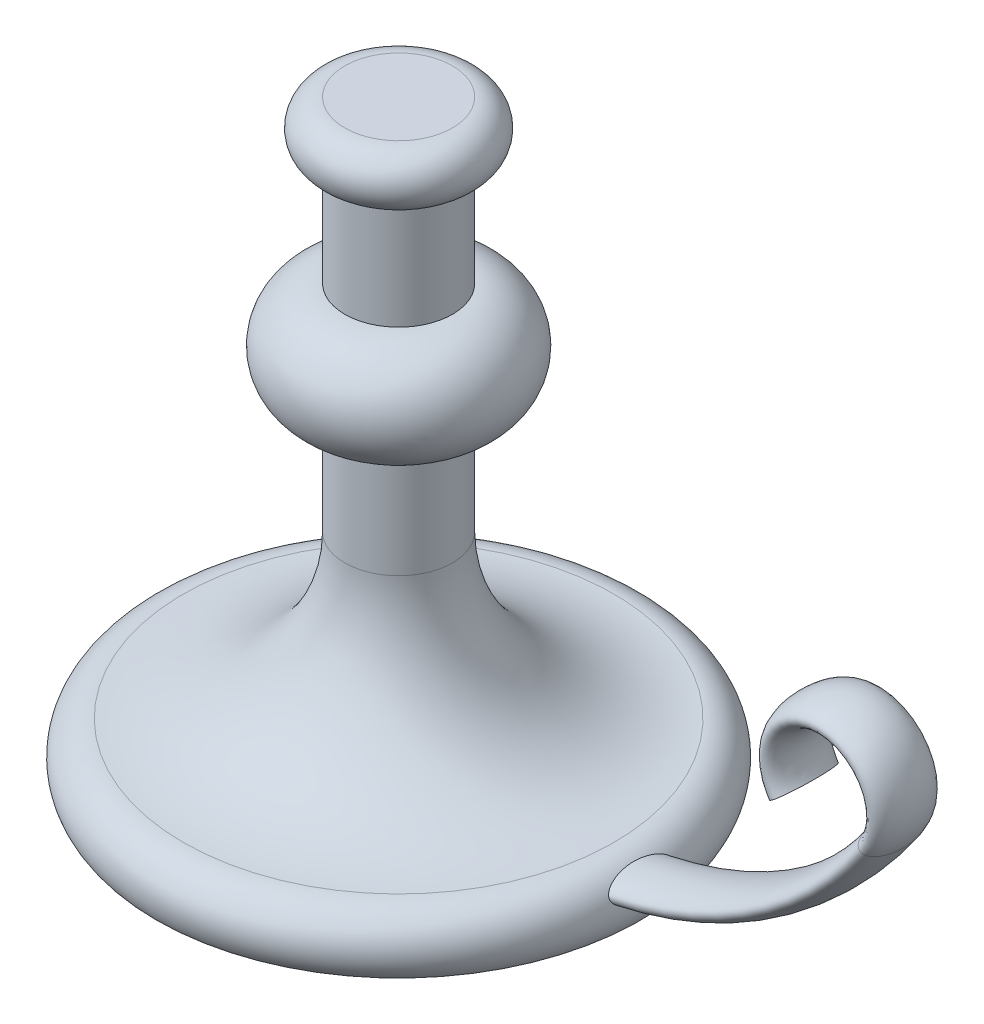
ISO-10303-21;
HEADER;
FILE_DESCRIPTION(('STEP AP214'),'2;1');
FILE_NAME('part.step','',(''),(''),'','','');
FILE_SCHEMA(('AUTOMOTIVE_DESIGN { 1 0 10303 214 1 1 1 1 }'));
ENDSEC;
DATA;
#1=APPLICATION_CONTEXT('core data for automotive mechanical design processes');
#2=APPLICATION_PROTOCOL_DEFINITION('international standard','automotive_design',2000,#1);
#3=PRODUCT_CONTEXT('',#1,'mechanical');
#4=PRODUCT('Part','Part','',(#3));
#5=PRODUCT_RELATED_PRODUCT_CATEGORY('part','',(#4));
#6=PRODUCT_DEFINITION_FORMATION('','',#4);
#7=PRODUCT_DEFINITION_CONTEXT('part definition',#1,'design');
#8=PRODUCT_DEFINITION('design','',#6,#7);
#9=PRODUCT_DEFINITION_SHAPE('','',#8);
#10=(LENGTH_UNIT() NAMED_UNIT(*) SI_UNIT(.MILLI.,.METRE.));
#11=(NAMED_UNIT(*) PLANE_ANGLE_UNIT() SI_UNIT($,.RADIAN.));
#12=(NAMED_UNIT(*) SI_UNIT($,.STERADIAN.) SOLID_ANGLE_UNIT());
#13=UNCERTAINTY_MEASURE_WITH_UNIT(LENGTH_MEASURE(1.E-05),#10,'distance_accuracy_value','');
#14=(GEOMETRIC_REPRESENTATION_CONTEXT(3) GLOBAL_UNCERTAINTY_ASSIGNED_CONTEXT((#13)) GLOBAL_UNIT_ASSIGNED_CONTEXT((#10,
#11,#12)) REPRESENTATION_CONTEXT('',''));
#15=CARTESIAN_POINT('',(0.,0.,0.));
#16=DIRECTION('',(0.,0.,1.));
#17=DIRECTION('',(1.,0.,0.));
#18=AXIS2_PLACEMENT_3D('',#15,#16,#17);
#19=CARTESIAN_POINT('',(0.,0.,0.));
#20=DIRECTION('',(0.,1.,0.));
#21=DIRECTION('',(0.,0.,1.));
#22=AXIS2_PLACEMENT_3D('',#19,#20,#21);
#23=PLANE('',#22);
#24=CARTESIAN_POINT('',(0.,0.,0.));
#25=DIRECTION('',(0.,1.,0.));
#26=DIRECTION('',(0.,0.,1.));
#27=AXIS2_PLACEMENT_3D('',#24,#25,#26);
#28=CIRCLE('',#27,90.);
#29=CARTESIAN_POINT('',(0.,0.,90.));
#30=VERTEX_POINT('',#29);
#31=EDGE_CURVE('E66',#30,#30,#28,.T.);
#32=ORIENTED_EDGE('',*,*,#31,.F.);
#33=EDGE_LOOP('',(#32));
#34=FACE_BOUND('',#33,.T.);
#35=ADVANCED_FACE('F36',(#34),#23,.F.);
#36=CARTESIAN_POINT('',(0.,220.,0.));
#37=DIRECTION('',(0.,-1.,0.));
#38=DIRECTION('',(0.,0.,-1.));
#39=AXIS2_PLACEMENT_3D('',#36,#37,#38);
#40=PLANE('',#39);
#41=CARTESIAN_POINT('',(0.,220.,0.));
#42=DIRECTION('',(0.,1.,0.));
#43=DIRECTION('',(0.,0.,1.));
#44=AXIS2_PLACEMENT_3D('',#41,#42,#43);
#45=CIRCLE('',#44,20.);
#46=CARTESIAN_POINT('',(0.,220.,20.));
#47=VERTEX_POINT('',#46);
#48=EDGE_CURVE('E10',#47,#47,#45,.T.);
#49=ORIENTED_EDGE('',*,*,#48,.T.);
#50=EDGE_LOOP('',(#49));
#51=FACE_BOUND('',#50,.T.);
#52=ADVANCED_FACE('F108',(#51),#40,.F.);
#53=CARTESIAN_POINT('',(0.,210.,0.));
#54=DIRECTION('',(0.,1.,0.));
#55=DIRECTION('',(0.,0.,1.));
#56=AXIS2_PLACEMENT_3D('',#53,#54,#55);
#57=TOROIDAL_SURFACE('',#56,20.,10.);
#58=ORIENTED_EDGE('',*,*,#48,.F.);
#59=EDGE_LOOP('',(#58));
#60=FACE_BOUND('',#59,.T.);
#61=CARTESIAN_POINT('',(0.,200.,0.));
#62=DIRECTION('',(0.,1.,0.));
#63=DIRECTION('',(0.,0.,1.));
#64=AXIS2_PLACEMENT_3D('',#61,#62,#63);
#65=CIRCLE('',#64,20.);
#66=CARTESIAN_POINT('',(0.,200.,20.));
#67=VERTEX_POINT('',#66);
#68=EDGE_CURVE('E48',#67,#67,#65,.T.);
#69=ORIENTED_EDGE('',*,*,#68,.T.);
#70=EDGE_LOOP('',(#69));
#71=FACE_BOUND('',#70,.T.);
#72=ADVANCED_FACE('F105',(#60,#71),#57,.T.);
#73=CARTESIAN_POINT('',(0.,301.66189863104,0.));
#74=DIRECTION('',(0.,1.,0.));
#75=DIRECTION('',(0.,0.,1.));
#76=AXIS2_PLACEMENT_3D('',#73,#74,#75);
#77=CYLINDRICAL_SURFACE('',#76,20.);
#78=ORIENTED_EDGE('',*,*,#68,.F.);
#79=EDGE_LOOP('',(#78));
#80=FACE_BOUND('',#79,.T.);
#81=CARTESIAN_POINT('',(0.,160.,0.));
#82=DIRECTION('',(0.,1.,0.));
#83=DIRECTION('',(0.,0.,1.));
#84=AXIS2_PLACEMENT_3D('',#81,#82,#83);
#85=CIRCLE('',#84,20.);
#86=CARTESIAN_POINT('',(0.,160.,20.));
#87=VERTEX_POINT('',#86);
#88=EDGE_CURVE('E52',#87,#87,#85,.T.);
#89=ORIENTED_EDGE('',*,*,#88,.T.);
#90=EDGE_LOOP('',(#89));
#91=FACE_BOUND('',#90,.T.);
#92=ADVANCED_FACE('F101',(#80,#91),#77,.T.);
#93=CARTESIAN_POINT('',(0.,140.,0.));
#94=DIRECTION('',(0.,1.,0.));
#95=DIRECTION('',(0.,0.,1.));
#96=AXIS2_PLACEMENT_3D('',#93,#94,#95);
#97=DEGENERATE_TOROIDAL_SURFACE('',#96,19.9999999999999,20.,.T.);
#98=ORIENTED_EDGE('',*,*,#88,.F.);
#99=EDGE_LOOP('',(#98));
#100=FACE_BOUND('',#99,.T.);
#101=CARTESIAN_POINT('',(0.,120.,0.));
#102=DIRECTION('',(0.,1.,0.));
#103=DIRECTION('',(0.,0.,1.));
#104=AXIS2_PLACEMENT_3D('',#101,#102,#103);
#105=CIRCLE('',#104,20.);
#106=CARTESIAN_POINT('',(0.,120.,20.));
#107=VERTEX_POINT('',#106);
#108=EDGE_CURVE('E57',#107,#107,#105,.T.);
#109=ORIENTED_EDGE('',*,*,#108,.T.);
#110=EDGE_LOOP('',(#109));
#111=FACE_BOUND('',#110,.T.);
#112=ADVANCED_FACE('F97',(#100,#111),#97,.T.);
#113=CARTESIAN_POINT('',(0.,301.66189863104,0.));
#114=DIRECTION('',(0.,1.,0.));
#115=DIRECTION('',(0.,0.,1.));
#116=AXIS2_PLACEMENT_3D('',#113,#114,#115);
#117=CYLINDRICAL_SURFACE('',#116,20.);
#118=ORIENTED_EDGE('',*,*,#108,.F.);
#119=EDGE_LOOP('',(#118));
#120=FACE_BOUND('',#119,.T.);
#121=CARTESIAN_POINT('',(0.,80.,0.));
#122=DIRECTION('',(0.,1.,0.));
#123=DIRECTION('',(0.,0.,1.));
#124=AXIS2_PLACEMENT_3D('',#121,#122,#123);
#125=CIRCLE('',#124,20.);
#126=CARTESIAN_POINT('',(0.,80.,20.));
#127=VERTEX_POINT('',#126);
#128=EDGE_CURVE('E60',#127,#127,#125,.T.);
#129=ORIENTED_EDGE('',*,*,#128,.T.);
#130=EDGE_LOOP('',(#129));
#131=FACE_BOUND('',#130,.T.);
#132=ADVANCED_FACE('F93',(#120,#131),#117,.T.);
#133=CARTESIAN_POINT('',(0.,80.,0.));
#134=DIRECTION('',(0.,1.,0.));
#135=DIRECTION('',(0.,0.,1.));
#136=AXIS2_PLACEMENT_3D('',#133,#134,#135);
#137=TOROIDAL_SURFACE('',#136,80.,60.);
#138=ORIENTED_EDGE('',*,*,#128,.F.);
#139=EDGE_LOOP('',(#138));
#140=FACE_BOUND('',#139,.T.);
#141=CARTESIAN_POINT('',(0.,20.,0.));
#142=DIRECTION('',(0.,1.,0.));
#143=DIRECTION('',(0.,0.,1.));
#144=AXIS2_PLACEMENT_3D('',#141,#142,#143);
#145=CIRCLE('',#144,80.0000000000002);
#146=CARTESIAN_POINT('',(0.,20.,80.0000000000002));
#147=VERTEX_POINT('',#146);
#148=EDGE_CURVE('E63',#147,#147,#145,.T.);
#149=ORIENTED_EDGE('',*,*,#148,.T.);
#150=EDGE_LOOP('',(#149));
#151=FACE_BOUND('',#150,.T.);
#152=ADVANCED_FACE('F89',(#140,#151),#137,.F.);
#153=CARTESIAN_POINT('',(0.,7.50000000000012,0.));
#154=DIRECTION('',(0.,1.,0.));
#155=DIRECTION('',(0.,0.,1.));
#156=AXIS2_PLACEMENT_3D('',#153,#154,#155);
#157=TOROIDAL_SURFACE('',#156,80.0000000000003,12.4999999999998);
#158=CARTESIAN_POINT('',(90.3650444247262,13.1056022951032,-12.1079986496694));
#159=CARTESIAN_POINT('',(90.3953344171669,13.0457657519692,-12.1079995788173));
#160=CARTESIAN_POINT('',(90.4254626602507,12.9858534342584,-12.1049478468171));
#161=CARTESIAN_POINT('',(90.4851825101059,12.8663516968071,-12.0928019828299));
#162=CARTESIAN_POINT('',(90.5147739485849,12.8067623823002,-12.0837059884374));
#163=CARTESIAN_POINT('',(90.57322301634,12.6883672231043,-12.0596890480769));
#164=CARTESIAN_POINT('',(90.6020802235625,12.6295618378862,-12.0447648290361));
#165=CARTESIAN_POINT('',(90.6588877567621,12.5131608281586,-12.0094532635097));
#166=CARTESIAN_POINT('',(90.6868378623216,12.455565498863,-11.9890646001929));
#167=CARTESIAN_POINT('',(90.7480820562558,12.3287155237725,-11.9379573212085));
#168=CARTESIAN_POINT('',(90.7811118454679,12.2598553678122,-11.9059395883533));
#169=CARTESIAN_POINT('',(90.8454973270755,12.1248557318381,-11.8352208891889));
#170=CARTESIAN_POINT('',(90.8768524900891,12.0587171136542,-11.7965178256972));
#171=CARTESIAN_POINT('',(90.9684370887323,11.8645335876216,-11.6716571479163));
#172=CARTESIAN_POINT('',(91.0261317640847,11.7408330471781,-11.5767957594499));
#173=CARTESIAN_POINT('',(91.1244088374528,11.5283714614446,-11.3906180566152));
#174=CARTESIAN_POINT('',(91.1661356204261,11.4374976407012,-11.3022092791319));
#175=CARTESIAN_POINT('',(91.2458693467372,11.2628410319498,-11.1170011632907));
#176=CARTESIAN_POINT('',(91.2838738206914,11.1790629561833,-11.0201963341931));
#177=CARTESIAN_POINT('',(91.3565997193174,11.0179359828742,-10.8199651058589));
#178=CARTESIAN_POINT('',(91.3913150643291,10.9405990218702,-10.7165270151956));
#179=CARTESIAN_POINT('',(91.457791612457,10.7918534117394,-10.5045293060962));
#180=CARTESIAN_POINT('',(91.4895516463404,10.7204471101956,-10.3959676859849));
#181=CARTESIAN_POINT('',(91.5506443575102,10.5825594446186,-10.1740598818109));
#182=CARTESIAN_POINT('',(91.5799594527219,10.5161140626667,-10.0606866395011));
#183=CARTESIAN_POINT('',(91.6362121339164,10.3881708279361,-9.83064816329137));
#184=CARTESIAN_POINT('',(91.6631500172368,10.3266723564916,-9.71398334351211));
#185=CARTESIAN_POINT('',(91.7408376909059,10.1487729935974,-9.35973365417152));
#186=CARTESIAN_POINT('',(91.7884141779778,10.0390753502167,-9.11807055089118));
#187=CARTESIAN_POINT('',(91.8767110243899,9.83452956016785,-8.62691299053791));
#188=CARTESIAN_POINT('',(91.9174182772854,9.73970982407319,-8.37740461667601));
#189=CARTESIAN_POINT('',(91.9929636571146,9.56305841174276,-7.87308702539998));
#190=CARTESIAN_POINT('',(92.0278037628512,9.48122235706377,-7.61827962788448));
#191=CARTESIAN_POINT('',(92.0837292155593,9.34943697643978,-7.17383117050763));
#192=CARTESIAN_POINT('',(92.10599254594,9.2968342482944,-6.98511262719887));
#193=CARTESIAN_POINT('',(92.1480587759864,9.19723277209145,-6.60592503585411));
#194=CARTESIAN_POINT('',(92.1678615408666,9.15023433103273,-6.41545589253651));
#195=CARTESIAN_POINT('',(92.2239133357581,9.01696496184984,-5.84160438785753));
#196=CARTESIAN_POINT('',(92.256771267833,8.93850174227734,-5.45605891308571));
#197=CARTESIAN_POINT('',(92.3146229253613,8.80000704338306,-4.68099254082324));
#198=CARTESIAN_POINT('',(92.3396133332789,8.73998333979584,-4.29147003760654));
#199=CARTESIAN_POINT('',(92.3825441024452,8.63668468503415,-3.50873674607181));
#200=CARTESIAN_POINT('',(92.400464702885,8.59345668453115,-3.11551872137659));
#201=CARTESIAN_POINT('',(92.4296584093647,8.5229570781298,-2.32763386681612));
#202=CARTESIAN_POINT('',(92.4409350060091,8.49567709357484,-1.93296790752996));
#203=CARTESIAN_POINT('',(92.4571533429001,8.45642288131329,-1.14282443002059));
#204=CARTESIAN_POINT('',(92.4620961900525,8.44444597919368,-0.747347065704524));
#205=CARTESIAN_POINT('',(92.4660013982228,8.43498499010465,0.0914159641724225));
#206=CARTESIAN_POINT('',(92.4641725547914,8.43941824943112,0.534728140301492));
#207=CARTESIAN_POINT('',(92.4526726744277,8.46726938960641,1.42078457645396));
#208=CARTESIAN_POINT('',(92.4429994233949,8.49069263041707,1.8635286407844));
#209=CARTESIAN_POINT('',(92.4154789186617,8.55721428556864,2.74762928905702));
#210=CARTESIAN_POINT('',(92.3976254777203,8.60032759278337,3.18898456768507));
#211=CARTESIAN_POINT('',(92.3531728832317,8.70739235783748,4.067761245367));
#212=CARTESIAN_POINT('',(92.3265937679934,8.77129606800371,4.50518932047296));
#213=CARTESIAN_POINT('',(92.2793960719973,8.88435497695634,5.15766844970777));
#214=CARTESIAN_POINT('',(92.2624467370552,8.92489721730413,5.37450160908864));
#215=CARTESIAN_POINT('',(92.2259185126876,9.0120956517451,5.80670673311153));
#216=CARTESIAN_POINT('',(92.2063398090096,9.05875141395259,6.02207879984212));
#217=CARTESIAN_POINT('',(92.1643537088004,9.15857098825636,6.45077860794111));
#218=CARTESIAN_POINT('',(92.1419495479037,9.21172735396666,6.66410839208792));
#219=CARTESIAN_POINT('',(92.0940156331485,9.32514898115348,7.08849895478747));
#220=CARTESIAN_POINT('',(92.0684861820624,9.38541355397956,7.29955995098452));
#221=CARTESIAN_POINT('',(92.0088476345032,9.5257563203962,7.75805387977868));
#222=CARTESIAN_POINT('',(91.9740267963342,9.60743251524525,8.00491162092463));
#223=CARTESIAN_POINT('',(91.8986918230666,9.78334343215815,8.49335896277465));
#224=CARTESIAN_POINT('',(91.8581756492878,9.87758265060666,8.73494664109807));
#225=CARTESIAN_POINT('',(91.7706020857297,10.080162756533,9.20963023167931));
#226=CARTESIAN_POINT('',(91.7235774223356,10.1884329292661,9.44276168919828));
#227=CARTESIAN_POINT('',(91.6469615571581,10.363637275861,9.78439605698211));
#228=CARTESIAN_POINT('',(91.6204199802123,10.424148856822,9.89689300609147));
#229=CARTESIAN_POINT('',(91.5650662843821,10.5498816416798,10.1186378018445));
#230=CARTESIAN_POINT('',(91.5362546798546,10.6151017784043,10.2278863768415));
#231=CARTESIAN_POINT('',(91.4835605162242,10.7338871266828,10.415741450389));
#232=CARTESIAN_POINT('',(91.4602321906687,10.7863212739676,10.4952163613179));
#233=CARTESIAN_POINT('',(91.4120070107176,10.8943429950818,10.6514777225461));
#234=CARTESIAN_POINT('',(91.3871102335156,10.9499304137054,10.7282643048663));
#235=CARTESIAN_POINT('',(91.3097420838669,11.1220254046875,10.9541771280331));
#236=CARTESIAN_POINT('',(91.2546521544413,11.2437316810257,11.0986398846702));
#237=CARTESIAN_POINT('',(91.1655460266923,11.4387050366538,11.302248235214));
#238=CARTESIAN_POINT('',(91.1345601157168,11.5062072887145,11.3682919284131));
#239=CARTESIAN_POINT('',(91.0703051272302,11.6454440996743,11.4946379847645));
#240=CARTESIAN_POINT('',(91.0370357085127,11.717179290842,11.5549394866792));
#241=CARTESIAN_POINT('',(90.9681842881204,11.864756740295,11.668381945738));
#242=CARTESIAN_POINT('',(90.9326086005183,11.9405876974583,11.721541323128));
#243=CARTESIAN_POINT('',(90.8590202289154,12.0964055336403,11.819405719182));
#244=CARTESIAN_POINT('',(90.8210090876389,12.1763897758138,11.8641160203381));
#245=CARTESIAN_POINT('',(90.7558672385255,12.3124519851983,11.9301038965668));
#246=CARTESIAN_POINT('',(90.7293941791075,12.3674874356814,11.9541971937069));
#247=CARTESIAN_POINT('',(90.675487030912,12.4789736042525,11.9975282506438));
#248=CARTESIAN_POINT('',(90.6480532346754,12.5354238900649,12.0167674740981));
#249=CARTESIAN_POINT('',(90.5923531613198,12.6494020484933,12.0499698374865));
#250=CARTESIAN_POINT('',(90.5640875590654,12.7069290344741,12.0639371340187));
#251=CARTESIAN_POINT('',(90.5068569448211,12.8227223822476,12.0862919723968));
#252=CARTESIAN_POINT('',(90.4778919199541,12.8809887576439,12.0946794114304));
#253=CARTESIAN_POINT('',(90.4193499643288,12.9980242872026,12.1056934456909));
#254=CARTESIAN_POINT('',(90.3897712121183,13.0567944949817,12.1082992799972));
#255=CARTESIAN_POINT('',(90.3303210289002,13.1741508477916,12.1076427991656));
#256=CARTESIAN_POINT('',(90.3004496042253,13.2327369967692,12.1043806107201));
#257=CARTESIAN_POINT('',(90.2406235235119,13.3492846430995,12.092101874123));
#258=CARTESIAN_POINT('',(90.2106688402273,13.4072458953822,12.0830831462952));
#259=CARTESIAN_POINT('',(90.1508824839697,13.522132053988,12.0595470605303));
#260=CARTESIAN_POINT('',(90.1210508798935,13.5790564283417,12.0450269590134));
#261=CARTESIAN_POINT('',(90.0560149799231,13.7022821170085,12.0075803012666));
#262=CARTESIAN_POINT('',(90.0208758710302,13.7682914360998,11.9835763629931));
#263=CARTESIAN_POINT('',(89.9512692953021,13.8979366829204,11.9290224531506));
#264=CARTESIAN_POINT('',(89.9168022962232,13.9615709840575,11.8984680885546));
#265=CARTESIAN_POINT('',(89.814604205069,14.1486290191413,11.7980977570117));
#266=CARTESIAN_POINT('',(89.748114798445,14.2681345250593,11.7195983150617));
#267=CARTESIAN_POINT('',(89.6333866860407,14.4708748698143,11.5646542502756));
#268=CARTESIAN_POINT('',(89.5843482154891,14.556309186604,11.4915489692098));
#269=CARTESIAN_POINT('',(89.4886502982518,14.7208496158944,11.337026833065));
#270=CARTESIAN_POINT('',(89.4419923063616,14.7999518750577,11.2556049845495));
#271=CARTESIAN_POINT('',(89.3509275782681,14.952342400007,11.0860830623767));
#272=CARTESIAN_POINT('',(89.3065249040642,15.0256203009916,10.997971605708));
#273=CARTESIAN_POINT('',(89.2198918583549,15.1667703556148,10.8164724641223));
#274=CARTESIAN_POINT('',(89.1776623466245,15.2346403754517,10.7230827211385));
#275=CARTESIAN_POINT('',(89.0963298298502,15.363721472871,10.5345785263535));
#276=CARTESIAN_POINT('',(89.0571737847018,15.425060813162,10.4395741979027));
#277=CARTESIAN_POINT('',(88.9806613053931,15.5434883575107,10.2462383689441));
#278=CARTESIAN_POINT('',(88.9433052335959,15.6005757068273,10.1479062052172));
#279=CARTESIAN_POINT('',(88.8337129879983,15.7661008034035,9.84865088895127));
#280=CARTESIAN_POINT('',(88.7639980191329,15.8687302554138,9.64357575844498));
#281=CARTESIAN_POINT('',(88.6304324348252,16.0611268129956,9.22518235667301));
#282=CARTESIAN_POINT('',(88.5665946441642,16.1508660185511,9.01184743709097));
#283=CARTESIAN_POINT('',(88.4444243628581,16.3190890735384,8.57936326694252));
#284=CARTESIAN_POINT('',(88.3860902585219,16.3975762256216,8.36021574493634));
#285=CARTESIAN_POINT('',(88.2519227876466,16.5746223463471,7.82764744990445));
#286=CARTESIAN_POINT('',(88.1785805949314,16.6684217435906,7.51202001193525));
#287=CARTESIAN_POINT('',(88.0413606563265,16.8397367568042,6.87414060895361));
#288=CARTESIAN_POINT('',(87.9774909048788,16.9172386409778,6.55188330677682));
#289=CARTESIAN_POINT('',(87.8590199499687,17.057967134407,5.90248305832664));
#290=CARTESIAN_POINT('',(87.8044221269076,17.1211885399828,5.57533837728173));
#291=CARTESIAN_POINT('',(87.7044082625477,17.2349162814632,4.91692086181997));
#292=CARTESIAN_POINT('',(87.6590072016961,17.2854019045664,4.58564221059579));
#293=CARTESIAN_POINT('',(87.5776048935869,17.3745985350374,3.92052191018861));
#294=CARTESIAN_POINT('',(87.5415993053733,17.4133149814436,3.58668151825246));
#295=CARTESIAN_POINT('',(87.4791061895073,17.4797711778855,2.91707404522573));
#296=CARTESIAN_POINT('',(87.4526178444351,17.5075118706305,2.58130713211862));
#297=CARTESIAN_POINT('',(87.3951402034084,17.5673090686814,1.68831804232272));
#298=CARTESIAN_POINT('',(87.372540809711,17.5903186980934,1.12990615056647));
#299=CARTESIAN_POINT('',(87.3542356331596,17.6089912846746,0.0120839961518292));
#300=CARTESIAN_POINT('',(87.3585371031343,17.6046468668288,-0.547326495096989));
#301=CARTESIAN_POINT('',(87.3939033025892,17.5684292654337,-1.66270467711561));
#302=CARTESIAN_POINT('',(87.4248856718045,17.5366407971321,-2.2186776649227));
#303=CARTESIAN_POINT('',(87.512929918595,17.4440879604064,-3.32592027180633));
#304=CARTESIAN_POINT('',(87.5699803779017,17.3833362778598,-3.87719184260242));
#305=CARTESIAN_POINT('',(87.6993202466225,17.2407734672704,-4.89228122925859));
#306=CARTESIAN_POINT('',(87.7681778489437,17.1633208498267,-5.35713748235291));
#307=CARTESIAN_POINT('',(87.8853430505043,17.0267643566158,-6.04854632423782));
#308=CARTESIAN_POINT('',(87.9267668872139,16.9777811846037,-6.27829741667951));
#309=CARTESIAN_POINT('',(88.014285999708,16.8723854452851,-6.73520551342333));
#310=CARTESIAN_POINT('',(88.0603813038783,16.8159728328334,-6.96236250195321));
#311=CARTESIAN_POINT('',(88.1669068956986,16.6830162244954,-7.45798529698968));
#312=CARTESIAN_POINT('',(88.2283711685039,16.6046962646467,-7.72575945700067));
#313=CARTESIAN_POINT('',(88.3584907196563,16.4345565719894,-8.25537061683916));
#314=CARTESIAN_POINT('',(88.4271491247875,16.3427309621657,-8.51720497440428));
#315=CARTESIAN_POINT('',(88.5719517937667,16.1436232819347,-9.03173594475365));
#316=CARTESIAN_POINT('',(88.6480666922015,16.0364011262264,-9.2844634355374));
#317=CARTESIAN_POINT('',(88.7686420010514,15.8614598878687,-9.6546437933089));
#318=CARTESIAN_POINT('',(88.8098848350657,15.8008193225108,-9.77650957180563));
#319=CARTESIAN_POINT('',(88.8946739457811,15.6743027305787,-10.0166566638274));
#320=CARTESIAN_POINT('',(88.9382196441416,15.6084280164382,-10.1349388657037));
#321=CARTESIAN_POINT('',(89.0164019511503,15.4883533955946,-10.3375494753595));
#322=CARTESIAN_POINT('',(89.0504859172075,15.4354482139187,-10.4228588666026));
#323=CARTESIAN_POINT('',(89.1201271832631,15.3261111718738,-10.5905737832693));
#324=CARTESIAN_POINT('',(89.1556844193265,15.2696794644903,-10.6729794344186));
#325=CARTESIAN_POINT('',(89.2284300470014,15.1528787939089,-10.8344642153458));
#326=CARTESIAN_POINT('',(89.2656211638283,15.0925031639953,-10.913537320288));
#327=CARTESIAN_POINT('',(89.3416744555685,14.96756972961,-11.0674874529981));
#328=CARTESIAN_POINT('',(89.3805366541905,14.9030118657957,-11.142364421198));
#329=CARTESIAN_POINT('',(89.460535547879,14.768512688018,-11.2879488034745));
#330=CARTESIAN_POINT('',(89.5016952002209,14.6985124268225,-11.3585895691478));
#331=CARTESIAN_POINT('',(89.5858900777333,14.5535488094372,-11.4934443824495));
#332=CARTESIAN_POINT('',(89.62892560491,14.47858465307,-11.5576573897156));
#333=CARTESIAN_POINT('',(89.7167493231271,14.323696483143,-11.6779943656169));
#334=CARTESIAN_POINT('',(89.7615327481851,14.2437856503165,-11.734138610057));
#335=CARTESIAN_POINT('',(89.8528179851754,14.0788733169035,-11.8367234792912));
#336=CARTESIAN_POINT('',(89.8993186835969,13.9938750936225,-11.8831702664509));
#337=CARTESIAN_POINT('',(89.9805967429387,13.843488642917,-11.9530998803335));
#338=CARTESIAN_POINT('',(90.0150402205992,13.7792162957571,-11.9793772541334));
#339=CARTESIAN_POINT('',(90.0844550641861,13.6485717926748,-12.0251042068496));
#340=CARTESIAN_POINT('',(90.1194262139317,13.582200485079,-12.0445565067288));
#341=CARTESIAN_POINT('',(90.1895738474772,13.4479542672364,-12.0759614803794));
#342=CARTESIAN_POINT('',(90.2247498627777,13.3800822024917,-12.0879272657268));
#343=CARTESIAN_POINT('',(90.2950369503777,13.2433742922884,-12.1039447706516));
#344=CARTESIAN_POINT('',(90.3301480309489,13.1745385807611,-12.1079975792199));
#345=CARTESIAN_POINT('',(90.3650444247262,13.1056022951032,-12.1079986496694));
#346=B_SPLINE_CURVE_WITH_KNOTS('',3,(#158,#159,#160,#161,#162,#163,#164,#165,#166,#167,#168,
#169,#170,#171,#172,#173,#174,#175,#176,#177,#178,#179,#180,#181,#182,#183,#184,#185,#186,#187,
#188,#189,#190,#191,#192,#193,#194,#195,#196,#197,#198,#199,#200,#201,#202,#203,#204,#205,#206,
#207,#208,#209,#210,#211,#212,#213,#214,#215,#216,#217,#218,#219,#220,#221,#222,#223,#224,#225,
#226,#227,#228,#229,#230,#231,#232,#233,#234,#235,#236,#237,#238,#239,#240,#241,#242,#243,#244,
#245,#246,#247,#248,#249,#250,#251,#252,#253,#254,#255,#256,#257,#258,#259,#260,#261,#262,#263,
#264,#265,#266,#267,#268,#269,#270,#271,#272,#273,#274,#275,#276,#277,#278,#279,#280,#281,#282,
#283,#284,#285,#286,#287,#288,#289,#290,#291,#292,#293,#294,#295,#296,#297,#298,#299,#300,#301,
#302,#303,#304,#305,#306,#307,#308,#309,#310,#311,#312,#313,#314,#315,#316,#317,#318,#319,#320,
#321,#322,#323,#324,#325,#326,#327,#328,#329,#330,#331,#332,#333,#334,#335,#336,#337,#338,#339,
#340,#341,#342,#343,#344,#345),.UNSPECIFIED.,.T.,.F.,(4,2,2,2,2,2,2,2,2,2,2,2,2,2,2,2,2,2,2,2,2,
2,2,2,2,2,2,2,2,2,2,2,2,2,2,2,2,2,2,2,2,2,2,2,2,2,2,2,2,2,2,2,2,2,2,2,2,2,2,2,2,2,2,2,2,2,2,2,2,
2,2,2,2,2,2,2,2,2,2,2,2,2,2,2,2,2,2,2,2,2,2,2,2,4),(0.,0.201120332346898,0.402302664217558,
0.603598140934941,0.804942169866759,1.05299053144795,1.30111684737405,1.7977639363531,
2.19768783276865,2.59787526716019,2.99878854226505,3.39985976532791,3.80360312797351,
4.20729591929676,5.01531610739935,5.82486097481205,6.63413225918094,7.22555053317948,
7.81700118978162,9.00078495964926,10.1850672346368,11.3726366322333,12.5595815509531,
13.7463190071988,15.0758571678073,16.4057707240316,17.7366918502793,19.0645776810555,
19.728215789868,20.3918070416564,21.0546451528671,21.7174191003025,22.50407182564,
23.2910068586068,24.0741197589807,24.4654066899495,24.8566052142946,25.1505942411406,
25.4445688102059,26.0332996901619,26.3312542793765,26.6292534868994,26.9264687338742,
27.2234975380301,27.4202773490641,27.6169977536232,27.8135627303366,28.0101313287768,
28.2074046424674,28.4046736970114,28.602017490541,28.7994598308452,29.0347145139048,
29.2701274662487,29.7412090373159,30.1087683233587,30.4765496114446,30.8449713803022,
31.2135378057378,31.5724016770988,31.93133749415,32.649616319441,33.3694271091965,
34.0890261888896,35.1003075920516,36.1124376864552,37.12493599925,38.1390705209991,
39.1527356529283,40.1663137020756,41.8429074507769,43.5199532508122,45.1918407221838,
46.8629965792637,48.290644209038,49.0061149730076,49.7215900847505,50.5782176324439,
51.4352190525778,52.2889716032258,52.715538989687,53.1419997522522,53.4599410465857,
53.7778685577665,54.0963481362155,54.4148322346199,54.7374456863963,55.0601112704986,
55.3819513008667,55.7035861874363,55.9358245346936,56.1679701896375,56.3997081276326,
56.6314141713999),.UNSPECIFIED.);
#347=CARTESIAN_POINT('',(90.3650444247262,13.1056022951032,-12.1079986496694));
#348=VERTEX_POINT('',#347);
#349=EDGE_CURVE('E39',#348,#348,#346,.T.);
#350=ORIENTED_EDGE('',*,*,#349,.T.);
#351=EDGE_LOOP('',(#350));
#352=FACE_BOUND('',#351,.T.);
#353=ORIENTED_EDGE('',*,*,#148,.F.);
#354=EDGE_LOOP('',(#353));
#355=FACE_BOUND('',#354,.T.);
#356=ORIENTED_EDGE('',*,*,#31,.T.);
#357=EDGE_LOOP('',(#356));
#358=FACE_BOUND('',#357,.T.);
#359=ADVANCED_FACE('F85',(#352,#355,#358),#157,.T.);
#360=CARTESIAN_POINT('',(60.,10.,0.));
#361=DIRECTION('',(1.,0.,0.));
#362=DIRECTION('',(0.,0.,-1.));
#363=AXIS2_PLACEMENT_3D('',#360,#361,#362);
#364=ELLIPSE('',#363,12.1079986496694,5.);
#365=CARTESIAN_POINT('',(60.,160.,0.));
#366=DIRECTION('',(0.,0.,1.));
#367=AXIS1_PLACEMENT('',#365,#366);
#368=SURFACE_OF_REVOLUTION('',#364,#367);
#369=CARTESIAN_POINT('',(183.592070943083,75.,0.));
#370=DIRECTION('',(0.566666666666667,0.823947139620551,0.));
#371=DIRECTION('',(0.,0.,-1.));
#372=AXIS2_PLACEMENT_3D('',#369,#370,#371);
#373=ELLIPSE('',#372,12.1079986496694,5.);
#374=CARTESIAN_POINT('',(183.592070943083,75.,-12.1079986496694));
#375=VERTEX_POINT('',#374);
#376=EDGE_CURVE('E72',#375,#375,#373,.T.);
#377=ORIENTED_EDGE('',*,*,#376,.F.);
#378=EDGE_LOOP('',(#377));
#379=FACE_BOUND('',#378,.T.);
#380=ORIENTED_EDGE('',*,*,#349,.F.);
#381=EDGE_LOOP('',(#380));
#382=FACE_BOUND('',#381,.T.);
#383=ADVANCED_FACE('F81',(#379,#382),#368,.F.);
#384=CARTESIAN_POINT('',(167.113128150672,86.3333333333333,0.));
#385=DIRECTION('',(0.,0.,1.));
#386=AXIS1_PLACEMENT('',#384,#385);
#387=SURFACE_OF_REVOLUTION('',#373,#386);
#388=ORIENTED_EDGE('',*,*,#376,.T.);
#389=EDGE_LOOP('',(#388));
#390=FACE_BOUND('',#389,.T.);
#391=CARTESIAN_POINT('',(150.634185358261,74.9999999999998,0.));
#392=DIRECTION('',(0.566666666666681,-0.823947139620542,0.));
#393=DIRECTION('',(0.,0.,-1.));
#394=AXIS2_PLACEMENT_3D('',#391,#392,#393);
#395=ELLIPSE('',#394,12.1079986496694,5.);
#396=CARTESIAN_POINT('',(150.634185358261,74.9999999999998,-12.1079986496694));
#397=VERTEX_POINT('',#396);
#398=EDGE_CURVE('E69',#397,#397,#395,.T.);
#399=ORIENTED_EDGE('',*,*,#398,.F.);
#400=EDGE_LOOP('',(#399));
#401=FACE_BOUND('',#400,.T.);
#402=ADVANCED_FACE('F78',(#390,#401),#387,.F.);
#403=CARTESIAN_POINT('',(150.634185358261,74.9999999999998,0.));
#404=DIRECTION('',(0.566666666666681,-0.823947139620542,0.));
#405=DIRECTION('',(0.,0.,-1.));
#406=AXIS2_PLACEMENT_3D('',#403,#404,#405);
#407=PLANE('',#406);
#408=ORIENTED_EDGE('',*,*,#398,.T.);
#409=EDGE_LOOP('',(#408));
#410=FACE_BOUND('',#409,.T.);
#411=ADVANCED_FACE('F80',(#410),#407,.T.);
#412=CLOSED_SHELL('',(#35,#52,#72,#92,#112,#132,#152,#359,#383,#402,#411));
#413=MANIFOLD_SOLID_BREP('B2',#412);
#414=ADVANCED_BREP_SHAPE_REPRESENTATION('',(#18,#413),#14);
#415=SHAPE_DEFINITION_REPRESENTATION(#9,#414);
ENDSEC;
END-ISO-10303-21;
